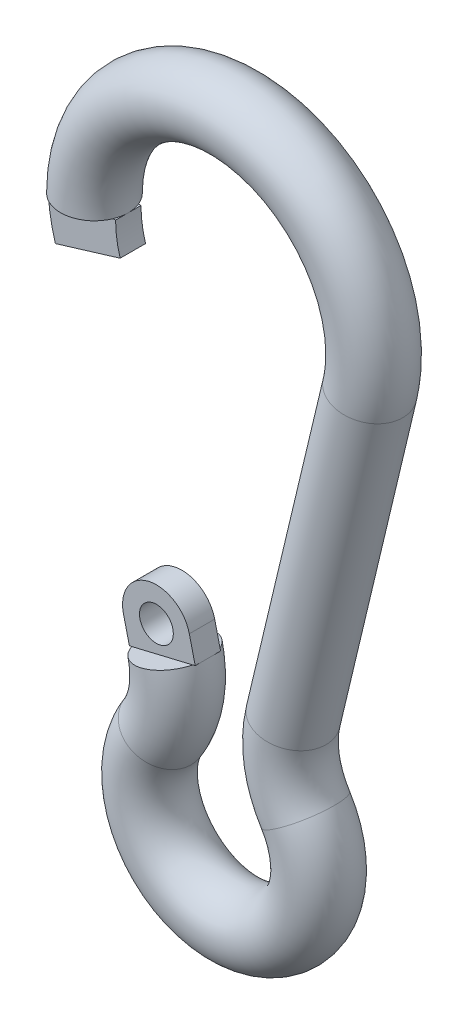
ISO-10303-21;
HEADER;
FILE_DESCRIPTION(('STEP AP214'),'2;1');
FILE_NAME('part.step','',(''),(''),'','','');
FILE_SCHEMA(('AUTOMOTIVE_DESIGN { 1 0 10303 214 1 1 1 1 }'));
ENDSEC;
DATA;
#1=APPLICATION_CONTEXT('core data for automotive mechanical design processes');
#2=APPLICATION_PROTOCOL_DEFINITION('international standard','automotive_design',2000,#1);
#3=PRODUCT_CONTEXT('',#1,'mechanical');
#4=PRODUCT('Part','Part','',(#3));
#5=PRODUCT_RELATED_PRODUCT_CATEGORY('part','',(#4));
#6=PRODUCT_DEFINITION_FORMATION('','',#4);
#7=PRODUCT_DEFINITION_CONTEXT('part definition',#1,'design');
#8=PRODUCT_DEFINITION('design','',#6,#7);
#9=PRODUCT_DEFINITION_SHAPE('','',#8);
#10=(LENGTH_UNIT() NAMED_UNIT(*) SI_UNIT(.MILLI.,.METRE.));
#11=(NAMED_UNIT(*) PLANE_ANGLE_UNIT() SI_UNIT($,.RADIAN.));
#12=(NAMED_UNIT(*) SI_UNIT($,.STERADIAN.) SOLID_ANGLE_UNIT());
#13=UNCERTAINTY_MEASURE_WITH_UNIT(LENGTH_MEASURE(1.E-05),#10,'distance_accuracy_value','');
#14=(GEOMETRIC_REPRESENTATION_CONTEXT(3) GLOBAL_UNCERTAINTY_ASSIGNED_CONTEXT((#13)) GLOBAL_UNIT_ASSIGNED_CONTEXT((#10,
#11,#12)) REPRESENTATION_CONTEXT('',''));
#15=CARTESIAN_POINT('',(0.,0.,0.));
#16=DIRECTION('',(0.,0.,1.));
#17=DIRECTION('',(1.,0.,0.));
#18=AXIS2_PLACEMENT_3D('',#15,#16,#17);
#19=CARTESIAN_POINT('',(-6.9800627029462,-41.8303564969621,0.));
#20=DIRECTION('',(0.232142913307645,-0.972681688838152,0.));
#21=DIRECTION('',(0.972681688838152,0.232142913307645,0.));
#22=AXIS2_PLACEMENT_3D('',#19,#20,#21);
#23=PLANE('',#22);
#24=DIRECTION('',(0.972681688838152,0.232142913307646,0.));
#25=VECTOR('',#24,1.);
#26=CARTESIAN_POINT('',(-3.08933594759359,-40.9017848437315,1.5));
#27=LINE('',#26,#25);
#28=CARTESIAN_POINT('',(-10.5868629375398,-42.6911654581932,1.5));
#29=VERTEX_POINT('',#28);
#30=CARTESIAN_POINT('',(-3.37326246835262,-40.969547535731,1.5));
#31=VERTEX_POINT('',#30);
#32=EDGE_CURVE('E64',#29,#31,#27,.T.);
#33=ORIENTED_EDGE('',*,*,#32,.F.);
#34=CARTESIAN_POINT('',(-6.9800627029462,-41.8303564969621,0.));
#35=DIRECTION('',(0.232142913307645,-0.972681688838152,0.));
#36=DIRECTION('',(0.972681688838152,0.232142913307645,0.));
#37=AXIS2_PLACEMENT_3D('',#34,#35,#36);
#38=CIRCLE('',#37,4.);
#39=EDGE_CURVE('E260',#31,#29,#38,.T.);
#40=ORIENTED_EDGE('',*,*,#39,.F.);
#41=EDGE_LOOP('',(#33,#40));
#42=FACE_BOUND('',#41,.T.);
#43=ADVANCED_FACE('F55',(#42),#23,.F.);
#44=CARTESIAN_POINT('',(-16.5,0.,0.));
#45=DIRECTION('',(0.,-1.,0.));
#46=DIRECTION('',(1.,0.,0.));
#47=AXIS2_PLACEMENT_3D('',#44,#45,#46);
#48=PLANE('',#47);
#49=CARTESIAN_POINT('',(-16.5,0.,0.));
#50=DIRECTION('',(0.,-1.,0.));
#51=DIRECTION('',(1.,0.,0.));
#52=AXIS2_PLACEMENT_3D('',#49,#50,#51);
#53=CIRCLE('',#52,4.);
#54=CARTESIAN_POINT('',(-20.2080992435478,0.,-1.5));
#55=VERTEX_POINT('',#54);
#56=CARTESIAN_POINT('',(-12.7919007564522,0.,-1.5));
#57=VERTEX_POINT('',#56);
#58=EDGE_CURVE('E374',#55,#57,#53,.T.);
#59=ORIENTED_EDGE('',*,*,#58,.T.);
#60=DIRECTION('',(-1.,0.,0.));
#61=VECTOR('',#60,1.);
#62=CARTESIAN_POINT('',(-20.5,-1.43150734892568E-13,-1.5));
#63=LINE('',#62,#61);
#64=EDGE_CURVE('E226',#57,#55,#63,.T.);
#65=ORIENTED_EDGE('',*,*,#64,.T.);
#66=EDGE_LOOP('',(#59,#65));
#67=FACE_BOUND('',#66,.T.);
#68=ADVANCED_FACE('F306',(#67),#48,.T.);
#69=DIRECTION('',(-1.,0.,0.));
#70=VECTOR('',#69,1.);
#71=CARTESIAN_POINT('',(-20.5,-1.43150734892568E-13,1.5));
#72=LINE('',#71,#70);
#73=CARTESIAN_POINT('',(-12.7919007564522,0.,1.5));
#74=VERTEX_POINT('',#73);
#75=CARTESIAN_POINT('',(-20.2080992435478,0.,1.5));
#76=VERTEX_POINT('',#75);
#77=EDGE_CURVE('E215',#74,#76,#72,.T.);
#78=ORIENTED_EDGE('',*,*,#77,.F.);
#79=EDGE_CURVE('E245',#74,#76,#53,.T.);
#80=ORIENTED_EDGE('',*,*,#79,.T.);
#81=EDGE_LOOP('',(#78,#80));
#82=FACE_BOUND('',#81,.T.);
#83=ADVANCED_FACE('F57',(#82),#48,.T.);
#84=CARTESIAN_POINT('',(-10.5868629375398,-42.6911654581932,-1.5));
#85=VERTEX_POINT('',#84);
#86=CARTESIAN_POINT('',(-3.37326246835262,-40.969547535731,-1.5));
#87=VERTEX_POINT('',#86);
#88=EDGE_CURVE('E74',#85,#87,#38,.T.);
#89=ORIENTED_EDGE('',*,*,#88,.F.);
#90=DIRECTION('',(0.972681688838152,0.232142913307646,0.));
#91=VECTOR('',#90,1.);
#92=CARTESIAN_POINT('',(-3.08933594759359,-40.9017848437315,-1.5));
#93=LINE('',#92,#91);
#94=EDGE_CURVE('E12',#85,#87,#93,.T.);
#95=ORIENTED_EDGE('',*,*,#94,.T.);
#96=EDGE_LOOP('',(#89,#95));
#97=FACE_BOUND('',#96,.T.);
#98=ADVANCED_FACE('F308',(#97),#23,.F.);
#99=CARTESIAN_POINT('',(0.,0.,0.));
#100=DIRECTION('',(0.,0.,-1.));
#101=DIRECTION('',(-1.,0.,0.));
#102=AXIS2_PLACEMENT_3D('',#99,#100,#101);
#103=TOROIDAL_SURFACE('',#102,16.5,4.);
#104=CARTESIAN_POINT('',(16.0492478658295,-3.83035806957611,0.));
#105=DIRECTION('',(0.232142913307642,0.972681688838152,0.));
#106=DIRECTION('',(-0.972681688838153,0.232142913307642,0.));
#107=AXIS2_PLACEMENT_3D('',#104,#105,#106);
#108=CIRCLE('',#107,4.);
#109=CARTESIAN_POINT('',(12.1585211104769,-2.90178641634554,0.));
#110=VERTEX_POINT('',#109);
#111=EDGE_CURVE('E244',#110,#110,#108,.T.);
#112=ORIENTED_EDGE('',*,*,#111,.T.);
#113=EDGE_LOOP('',(#112));
#114=FACE_BOUND('',#113,.T.);
#115=CARTESIAN_POINT('',(-12.5,0.,0.));
#116=VERTEX_POINT('',#115);
#117=EDGE_CURVE('E241',#116,#74,#53,.T.);
#118=ORIENTED_EDGE('',*,*,#117,.F.);
#119=EDGE_CURVE('E240',#57,#116,#53,.T.);
#120=ORIENTED_EDGE('',*,*,#119,.F.);
#121=ORIENTED_EDGE('',*,*,#58,.F.);
#122=CARTESIAN_POINT('',(-20.5,0.,0.));
#123=VERTEX_POINT('',#122);
#124=EDGE_CURVE('E375',#123,#55,#53,.T.);
#125=ORIENTED_EDGE('',*,*,#124,.F.);
#126=EDGE_CURVE('E378',#76,#123,#53,.T.);
#127=ORIENTED_EDGE('',*,*,#126,.F.);
#128=ORIENTED_EDGE('',*,*,#79,.F.);
#129=EDGE_LOOP('',(#118,#120,#121,#125,#127,#128));
#130=FACE_BOUND('',#129,.T.);
#131=ADVANCED_FACE('F316',(#114,#130),#103,.T.);
#132=CARTESIAN_POINT('',(16.0492478658295,-3.83035806957611,0.));
#133=DIRECTION('',(-0.232142913307644,-0.972681688838152,0.));
#134=DIRECTION('',(0.972681688838152,-0.232142913307644,0.));
#135=AXIS2_PLACEMENT_3D('',#132,#133,#134);
#136=CYLINDRICAL_SURFACE('',#135,4.);
#137=CARTESIAN_POINT('',(6.9800627029462,-41.8303564969621,0.));
#138=DIRECTION('',(0.232142913307642,0.972681688838153,0.));
#139=DIRECTION('',(-0.972681688838153,0.232142913307642,0.));
#140=AXIS2_PLACEMENT_3D('',#137,#138,#139);
#141=CIRCLE('',#140,4.);
#142=CARTESIAN_POINT('',(3.0893359475936,-40.9017848437315,0.));
#143=VERTEX_POINT('',#142);
#144=EDGE_CURVE('E248',#143,#143,#141,.T.);
#145=ORIENTED_EDGE('',*,*,#144,.T.);
#146=EDGE_LOOP('',(#145));
#147=FACE_BOUND('',#146,.T.);
#148=ORIENTED_EDGE('',*,*,#111,.F.);
#149=EDGE_LOOP('',(#148));
#150=FACE_BOUND('',#149,.T.);
#151=ADVANCED_FACE('F321',(#147,#150),#136,.T.);
#152=CARTESIAN_POINT('',(18.1659021245849,-44.5,0.));
#153=DIRECTION('',(0.,0.,1.));
#154=DIRECTION('',(1.,0.,0.));
#155=AXIS2_PLACEMENT_3D('',#152,#153,#154);
#156=TOROIDAL_SURFACE('',#155,11.5,4.);
#157=CARTESIAN_POINT('',(8.44925680213253,-50.6511627906977,0.));
#158=DIRECTION('',(-0.534883720930233,0.844925680213253,0.));
#159=DIRECTION('',(-0.844925680213253,-0.534883720930233,0.));
#160=AXIS2_PLACEMENT_3D('',#157,#158,#159);
#161=CIRCLE('',#160,4.);
#162=CARTESIAN_POINT('',(5.06955408127952,-52.7906976744186,0.));
#163=VERTEX_POINT('',#162);
#164=EDGE_CURVE('E251',#163,#163,#161,.T.);
#165=CARTESIAN_POINT('',(18.1659021245849,-44.5,0.));
#166=DIRECTION('',(0.,0.,1.));
#167=DIRECTION('',(1.,0.,0.));
#168=AXIS2_PLACEMENT_3D('',#165,#166,#167);
#169=CIRCLE('',#168,15.5);
#170=EDGE_CURVE('',#143,#163,#169,.T.);
#171=ORIENTED_EDGE('',*,*,#144,.F.);
#172=ORIENTED_EDGE('',*,*,#164,.T.);
#173=ORIENTED_EDGE('',*,*,#170,.T.);
#174=ORIENTED_EDGE('',*,*,#170,.F.);
#175=EDGE_LOOP('',(#171,#173,#172,#174));
#176=FACE_BOUND('',#175,.T.);
#177=ADVANCED_FACE('F528',(#176),#156,.T.);
#178=CARTESIAN_POINT('',(0.,-56.,0.));
#179=DIRECTION('',(0.,0.,-1.));
#180=DIRECTION('',(-1.,0.,0.));
#181=AXIS2_PLACEMENT_3D('',#178,#179,#180);
#182=TOROIDAL_SURFACE('',#181,10.,4.);
#183=CARTESIAN_POINT('',(-8.44925680213253,-50.6511627906977,0.));
#184=DIRECTION('',(-0.534883720930231,-0.844925680213254,0.));
#185=DIRECTION('',(0.844925680213254,-0.534883720930232,0.));
#186=AXIS2_PLACEMENT_3D('',#183,#184,#185);
#187=CIRCLE('',#186,4.);
#188=CARTESIAN_POINT('',(-5.06955408127951,-52.7906976744186,0.));
#189=VERTEX_POINT('',#188);
#190=EDGE_CURVE('E253',#189,#189,#187,.T.);
#191=ORIENTED_EDGE('',*,*,#190,.T.);
#192=EDGE_LOOP('',(#191));
#193=FACE_BOUND('',#192,.T.);
#194=ORIENTED_EDGE('',*,*,#164,.F.);
#195=EDGE_LOOP('',(#194));
#196=FACE_BOUND('',#195,.T.);
#197=ADVANCED_FACE('F339',(#193,#196),#182,.T.);
#198=CARTESIAN_POINT('',(-18.1659021245849,-44.5,0.));
#199=DIRECTION('',(0.,0.,1.));
#200=DIRECTION('',(1.,0.,0.));
#201=AXIS2_PLACEMENT_3D('',#198,#199,#200);
#202=TOROIDAL_SURFACE('',#201,11.5,4.);
#203=CARTESIAN_POINT('',(-3.08933594759359,-40.9017848437315,0.));
#204=VERTEX_POINT('',#203);
#205=EDGE_CURVE('E59',#204,#31,#38,.T.);
#206=ORIENTED_EDGE('',*,*,#205,.T.);
#207=ORIENTED_EDGE('',*,*,#39,.T.);
#208=CARTESIAN_POINT('',(-10.8707894582988,-42.7589281501927,0.));
#209=VERTEX_POINT('',#208);
#210=EDGE_CURVE('E264',#29,#209,#38,.T.);
#211=ORIENTED_EDGE('',*,*,#210,.T.);
#212=EDGE_CURVE('E259',#209,#85,#38,.T.);
#213=ORIENTED_EDGE('',*,*,#212,.T.);
#214=ORIENTED_EDGE('',*,*,#88,.T.);
#215=EDGE_CURVE('E172',#87,#204,#38,.T.);
#216=ORIENTED_EDGE('',*,*,#215,.T.);
#217=EDGE_LOOP('',(#206,#207,#211,#213,#214,#216));
#218=FACE_BOUND('',#217,.T.);
#219=ORIENTED_EDGE('',*,*,#190,.F.);
#220=EDGE_LOOP('',(#219));
#221=FACE_BOUND('',#220,.T.);
#222=ADVANCED_FACE('F267',(#218,#221),#202,.T.);
#223=CARTESIAN_POINT('',(-20.5,-1.43150734892568E-13,1.5));
#224=DIRECTION('',(0.,-1.,0.));
#225=DIRECTION('',(1.,0.,0.));
#226=AXIS2_PLACEMENT_3D('',#223,#224,#225);
#227=PLANE('',#226);
#228=CARTESIAN_POINT('',(-20.5,-1.43150734892568E-13,1.5));
#229=VERTEX_POINT('',#228);
#230=EDGE_CURVE('E210',#76,#229,#72,.T.);
#231=ORIENTED_EDGE('',*,*,#230,.F.);
#232=ORIENTED_EDGE('',*,*,#126,.T.);
#233=DIRECTION('',(0.,0.,-1.));
#234=VECTOR('',#233,1.);
#235=CARTESIAN_POINT('',(-20.5,-1.43150734892568E-13,1.5));
#236=LINE('',#235,#234);
#237=EDGE_CURVE('E227',#229,#123,#236,.T.);
#238=ORIENTED_EDGE('',*,*,#237,.F.);
#239=EDGE_LOOP('',(#231,#232,#238));
#240=FACE_BOUND('',#239,.T.);
#241=ADVANCED_FACE('F325',(#240),#227,.F.);
#242=CARTESIAN_POINT('',(-20.5,-1.43150734892568E-13,-1.5));
#243=VERTEX_POINT('',#242);
#244=EDGE_CURVE('E214',#123,#243,#236,.T.);
#245=ORIENTED_EDGE('',*,*,#244,.F.);
#246=ORIENTED_EDGE('',*,*,#124,.T.);
#247=EDGE_CURVE('E223',#55,#243,#63,.T.);
#248=ORIENTED_EDGE('',*,*,#247,.T.);
#249=EDGE_LOOP('',(#245,#246,#248));
#250=FACE_BOUND('',#249,.T.);
#251=ADVANCED_FACE('F329',(#250),#227,.F.);
#252=DIRECTION('',(0.,0.,-1.));
#253=VECTOR('',#252,1.);
#254=CARTESIAN_POINT('',(-12.5,-1.43114686768087E-13,1.5));
#255=LINE('',#254,#253);
#256=CARTESIAN_POINT('',(-12.5,-1.43114686768087E-13,1.5));
#257=VERTEX_POINT('',#256);
#258=EDGE_CURVE('E231',#257,#116,#255,.T.);
#259=ORIENTED_EDGE('',*,*,#258,.T.);
#260=ORIENTED_EDGE('',*,*,#117,.T.);
#261=EDGE_CURVE('E211',#257,#74,#72,.T.);
#262=ORIENTED_EDGE('',*,*,#261,.F.);
#263=EDGE_LOOP('',(#259,#260,#262));
#264=FACE_BOUND('',#263,.T.);
#265=ADVANCED_FACE('F337',(#264),#227,.F.);
#266=CARTESIAN_POINT('',(0.,0.,1.5));
#267=DIRECTION('',(0.,0.,-1.));
#268=DIRECTION('',(-1.,0.,0.));
#269=AXIS2_PLACEMENT_3D('',#266,#267,#268);
#270=CYLINDRICAL_SURFACE('',#269,20.5);
#271=CARTESIAN_POINT('',(0.,0.,-1.5));
#272=DIRECTION('',(0.,0.,1.));
#273=DIRECTION('',(1.,0.,0.));
#274=AXIS2_PLACEMENT_3D('',#271,#272,#273);
#275=CIRCLE('',#274,20.5);
#276=CARTESIAN_POINT('',(-19.6145969362954,-5.95966333165492,-1.5));
#277=VERTEX_POINT('',#276);
#278=EDGE_CURVE('E200',#243,#277,#275,.T.);
#279=ORIENTED_EDGE('',*,*,#278,.T.);
#280=DIRECTION('',(0.,0.,-1.));
#281=VECTOR('',#280,1.);
#282=CARTESIAN_POINT('',(-19.6145969362954,-5.95966333165492,1.5));
#283=LINE('',#282,#281);
#284=CARTESIAN_POINT('',(-19.6145969362954,-5.95966333165492,1.5));
#285=VERTEX_POINT('',#284);
#286=EDGE_CURVE('E237',#285,#277,#283,.T.);
#287=ORIENTED_EDGE('',*,*,#286,.F.);
#288=CARTESIAN_POINT('',(0.,0.,1.5));
#289=DIRECTION('',(0.,0.,1.));
#290=DIRECTION('',(1.,0.,0.));
#291=AXIS2_PLACEMENT_3D('',#288,#289,#290);
#292=CIRCLE('',#291,20.5);
#293=EDGE_CURVE('E202',#229,#285,#292,.T.);
#294=ORIENTED_EDGE('',*,*,#293,.F.);
#295=ORIENTED_EDGE('',*,*,#237,.T.);
#296=ORIENTED_EDGE('',*,*,#244,.T.);
#297=EDGE_LOOP('',(#279,#287,#294,#295,#296));
#298=FACE_BOUND('',#297,.T.);
#299=ADVANCED_FACE('F357',(#298),#270,.T.);
#300=CARTESIAN_POINT('',(-19.6145969362954,-5.95966333165492,1.5));
#301=DIRECTION('',(-0.290715284470972,0.956809606648555,0.));
#302=DIRECTION('',(-0.956809606648555,-0.290715284470972,0.));
#303=AXIS2_PLACEMENT_3D('',#300,#301,#302);
#304=PLANE('',#303);
#305=DIRECTION('',(0.956809606648555,0.290715284470972,0.));
#306=VECTOR('',#305,1.);
#307=CARTESIAN_POINT('',(-19.6145969362954,-5.95966333165492,-1.5));
#308=LINE('',#307,#306);
#309=CARTESIAN_POINT('',(-11.9601200831069,-3.63394105588715,-1.5));
#310=VERTEX_POINT('',#309);
#311=EDGE_CURVE('E218',#277,#310,#308,.T.);
#312=ORIENTED_EDGE('',*,*,#311,.T.);
#313=DIRECTION('',(0.,0.,-1.));
#314=VECTOR('',#313,1.);
#315=CARTESIAN_POINT('',(-11.9601200831069,-3.63394105588715,1.5));
#316=LINE('',#315,#314);
#317=CARTESIAN_POINT('',(-11.9601200831069,-3.63394105588715,1.5));
#318=VERTEX_POINT('',#317);
#319=EDGE_CURVE('E234',#318,#310,#316,.T.);
#320=ORIENTED_EDGE('',*,*,#319,.F.);
#321=DIRECTION('',(0.956809606648555,0.290715284470972,0.));
#322=VECTOR('',#321,1.);
#323=CARTESIAN_POINT('',(-19.6145969362954,-5.95966333165492,1.5));
#324=LINE('',#323,#322);
#325=EDGE_CURVE('E205',#285,#318,#324,.T.);
#326=ORIENTED_EDGE('',*,*,#325,.F.);
#327=ORIENTED_EDGE('',*,*,#286,.T.);
#328=EDGE_LOOP('',(#312,#320,#326,#327));
#329=FACE_BOUND('',#328,.T.);
#330=ADVANCED_FACE('F354',(#329),#304,.F.);
#331=CARTESIAN_POINT('',(0.,0.,1.5));
#332=DIRECTION('',(0.,0.,-1.));
#333=DIRECTION('',(-1.,0.,0.));
#334=AXIS2_PLACEMENT_3D('',#331,#332,#333);
#335=CYLINDRICAL_SURFACE('',#334,12.5);
#336=CARTESIAN_POINT('',(0.,0.,-1.5));
#337=DIRECTION('',(0.,0.,-1.));
#338=DIRECTION('',(1.,0.,0.));
#339=AXIS2_PLACEMENT_3D('',#336,#337,#338);
#340=CIRCLE('',#339,12.5);
#341=CARTESIAN_POINT('',(-12.5,-1.43114686768087E-13,-1.5));
#342=VERTEX_POINT('',#341);
#343=EDGE_CURVE('E220',#310,#342,#340,.T.);
#344=ORIENTED_EDGE('',*,*,#343,.T.);
#345=EDGE_CURVE('E230',#116,#342,#255,.T.);
#346=ORIENTED_EDGE('',*,*,#345,.F.);
#347=ORIENTED_EDGE('',*,*,#258,.F.);
#348=CARTESIAN_POINT('',(0.,0.,1.5));
#349=DIRECTION('',(0.,0.,-1.));
#350=DIRECTION('',(1.,0.,0.));
#351=AXIS2_PLACEMENT_3D('',#348,#349,#350);
#352=CIRCLE('',#351,12.5);
#353=EDGE_CURVE('E208',#318,#257,#352,.T.);
#354=ORIENTED_EDGE('',*,*,#353,.F.);
#355=ORIENTED_EDGE('',*,*,#319,.T.);
#356=EDGE_LOOP('',(#344,#346,#347,#354,#355));
#357=FACE_BOUND('',#356,.T.);
#358=ADVANCED_FACE('F345',(#357),#335,.F.);
#359=EDGE_CURVE('E206',#342,#57,#63,.T.);
#360=ORIENTED_EDGE('',*,*,#359,.T.);
#361=ORIENTED_EDGE('',*,*,#119,.T.);
#362=ORIENTED_EDGE('',*,*,#345,.T.);
#363=EDGE_LOOP('',(#360,#361,#362));
#364=FACE_BOUND('',#363,.T.);
#365=ADVANCED_FACE('F332',(#364),#227,.F.);
#366=CARTESIAN_POINT('',(0.,0.,1.5));
#367=DIRECTION('',(0.,0.,1.));
#368=DIRECTION('',(1.,0.,0.));
#369=AXIS2_PLACEMENT_3D('',#366,#367,#368);
#370=PLANE('',#369);
#371=ORIENTED_EDGE('',*,*,#293,.T.);
#372=ORIENTED_EDGE('',*,*,#325,.T.);
#373=ORIENTED_EDGE('',*,*,#353,.T.);
#374=ORIENTED_EDGE('',*,*,#261,.T.);
#375=ORIENTED_EDGE('',*,*,#77,.T.);
#376=ORIENTED_EDGE('',*,*,#230,.T.);
#377=EDGE_LOOP('',(#371,#372,#373,#374,#375,#376));
#378=FACE_BOUND('',#377,.T.);
#379=ADVANCED_FACE('F344',(#378),#370,.T.);
#380=CARTESIAN_POINT('',(0.,0.,-1.5));
#381=DIRECTION('',(0.,0.,1.));
#382=DIRECTION('',(1.,0.,0.));
#383=AXIS2_PLACEMENT_3D('',#380,#381,#382);
#384=PLANE('',#383);
#385=ORIENTED_EDGE('',*,*,#278,.F.);
#386=ORIENTED_EDGE('',*,*,#247,.F.);
#387=ORIENTED_EDGE('',*,*,#64,.F.);
#388=ORIENTED_EDGE('',*,*,#359,.F.);
#389=ORIENTED_EDGE('',*,*,#343,.F.);
#390=ORIENTED_EDGE('',*,*,#311,.F.);
#391=EDGE_LOOP('',(#385,#386,#387,#388,#389,#390));
#392=FACE_BOUND('',#391,.T.);
#393=ADVANCED_FACE('F351',(#392),#384,.F.);
#394=CARTESIAN_POINT('',(-3.08933594759359,-40.9017848437315,1.5));
#395=DIRECTION('',(-0.232142913307646,0.972681688838152,0.));
#396=DIRECTION('',(-0.972681688838152,-0.232142913307646,0.));
#397=AXIS2_PLACEMENT_3D('',#394,#395,#396);
#398=PLANE('',#397);
#399=ORIENTED_EDGE('',*,*,#210,.F.);
#400=CARTESIAN_POINT('',(-10.8707894582988,-42.7589281501927,1.5));
#401=VERTEX_POINT('',#400);
#402=EDGE_CURVE('E189',#401,#29,#27,.T.);
#403=ORIENTED_EDGE('',*,*,#402,.F.);
#404=DIRECTION('',(0.,0.,-1.));
#405=VECTOR('',#404,1.);
#406=CARTESIAN_POINT('',(-10.8707894582988,-42.7589281501927,1.5));
#407=LINE('',#406,#405);
#408=EDGE_CURVE('E168',#401,#209,#407,.T.);
#409=ORIENTED_EDGE('',*,*,#408,.T.);
#410=EDGE_LOOP('',(#399,#403,#409));
#411=FACE_BOUND('',#410,.T.);
#412=ADVANCED_FACE('F299',(#411),#398,.F.);
#413=ORIENTED_EDGE('',*,*,#212,.F.);
#414=CARTESIAN_POINT('',(-10.8707894582988,-42.7589281501927,-1.5));
#415=VERTEX_POINT('',#414);
#416=EDGE_CURVE('E274',#209,#415,#407,.T.);
#417=ORIENTED_EDGE('',*,*,#416,.T.);
#418=EDGE_CURVE('E66',#415,#85,#93,.T.);
#419=ORIENTED_EDGE('',*,*,#418,.T.);
#420=EDGE_LOOP('',(#413,#417,#419));
#421=FACE_BOUND('',#420,.T.);
#422=ADVANCED_FACE('F273',(#421),#398,.F.);
#423=ORIENTED_EDGE('',*,*,#205,.F.);
#424=DIRECTION('',(0.,0.,-1.));
#425=VECTOR('',#424,1.);
#426=CARTESIAN_POINT('',(-3.08933594759359,-40.9017848437315,1.5));
#427=LINE('',#426,#425);
#428=CARTESIAN_POINT('',(-3.08933594759359,-40.9017848437315,1.5));
#429=VERTEX_POINT('',#428);
#430=EDGE_CURVE('E165',#429,#204,#427,.T.);
#431=ORIENTED_EDGE('',*,*,#430,.F.);
#432=EDGE_CURVE('E193',#31,#429,#27,.T.);
#433=ORIENTED_EDGE('',*,*,#432,.F.);
#434=EDGE_LOOP('',(#423,#431,#433));
#435=FACE_BOUND('',#434,.T.);
#436=ADVANCED_FACE('F291',(#435),#398,.F.);
#437=CARTESIAN_POINT('',(-7.67649144286914,-38.9123114304476,1.5));
#438=DIRECTION('',(0.,0.,-1.));
#439=DIRECTION('',(-1.,0.,0.));
#440=AXIS2_PLACEMENT_3D('',#437,#438,#439);
#441=PLANE('',#440);
#442=DIRECTION('',(-0.232142913307646,0.972681688838152,0.));
#443=VECTOR('',#442,1.);
#444=CARTESIAN_POINT('',(-3.78576468751653,-37.9837397772171,1.5));
#445=LINE('',#444,#443);
#446=CARTESIAN_POINT('',(-3.78576468751653,-37.9837397772171,1.5));
#447=VERTEX_POINT('',#446);
#448=EDGE_CURVE('E174',#429,#447,#445,.T.);
#449=ORIENTED_EDGE('',*,*,#448,.T.);
#450=CARTESIAN_POINT('',(-7.67649144286914,-38.9123114304476,1.5));
#451=DIRECTION('',(0.,0.,1.));
#452=DIRECTION('',(-1.,0.,0.));
#453=AXIS2_PLACEMENT_3D('',#450,#451,#452);
#454=CIRCLE('',#453,4.);
#455=CARTESIAN_POINT('',(-11.5672181982218,-39.8408830836782,1.5));
#456=VERTEX_POINT('',#455);
#457=EDGE_CURVE('E195',#447,#456,#454,.T.);
#458=ORIENTED_EDGE('',*,*,#457,.T.);
#459=DIRECTION('',(0.232142913307647,-0.972681688838151,0.));
#460=VECTOR('',#459,1.);
#461=CARTESIAN_POINT('',(-10.8707894582988,-42.7589281501927,1.5));
#462=LINE('',#461,#460);
#463=EDGE_CURVE('E192',#456,#401,#462,.T.);
#464=ORIENTED_EDGE('',*,*,#463,.T.);
#465=ORIENTED_EDGE('',*,*,#402,.T.);
#466=ORIENTED_EDGE('',*,*,#32,.T.);
#467=ORIENTED_EDGE('',*,*,#432,.T.);
#468=EDGE_LOOP('',(#449,#458,#464,#465,#466,#467));
#469=FACE_BOUND('',#468,.T.);
#470=CARTESIAN_POINT('',(-7.67649144286914,-38.9123114304476,1.5));
#471=DIRECTION('',(0.,0.,1.));
#472=DIRECTION('',(1.,0.,0.));
#473=AXIS2_PLACEMENT_3D('',#470,#471,#472);
#474=CIRCLE('',#473,2.);
#475=CARTESIAN_POINT('',(-5.67649144286914,-38.9123114304476,1.5));
#476=VERTEX_POINT('',#475);
#477=EDGE_CURVE('E180',#476,#476,#474,.T.);
#478=ORIENTED_EDGE('',*,*,#477,.F.);
#479=EDGE_LOOP('',(#478));
#480=FACE_BOUND('',#479,.T.);
#481=ADVANCED_FACE('F287',(#469,#480),#441,.F.);
#482=CARTESIAN_POINT('',(-7.67649144286914,-38.9123114304476,-1.5));
#483=DIRECTION('',(0.,0.,-1.));
#484=DIRECTION('',(-1.,0.,0.));
#485=AXIS2_PLACEMENT_3D('',#482,#483,#484);
#486=PLANE('',#485);
#487=DIRECTION('',(-0.232142913307646,0.972681688838152,0.));
#488=VECTOR('',#487,1.);
#489=CARTESIAN_POINT('',(-3.78576468751653,-37.9837397772171,-1.5));
#490=LINE('',#489,#488);
#491=CARTESIAN_POINT('',(-3.08933594759359,-40.9017848437315,-1.5));
#492=VERTEX_POINT('',#491);
#493=CARTESIAN_POINT('',(-3.78576468751653,-37.9837397772171,-1.5));
#494=VERTEX_POINT('',#493);
#495=EDGE_CURVE('E162',#492,#494,#490,.T.);
#496=ORIENTED_EDGE('',*,*,#495,.F.);
#497=EDGE_CURVE('E67',#87,#492,#93,.T.);
#498=ORIENTED_EDGE('',*,*,#497,.F.);
#499=ORIENTED_EDGE('',*,*,#94,.F.);
#500=ORIENTED_EDGE('',*,*,#418,.F.);
#501=DIRECTION('',(0.232142913307647,-0.972681688838151,0.));
#502=VECTOR('',#501,1.);
#503=CARTESIAN_POINT('',(-10.8707894582988,-42.7589281501927,-1.5));
#504=LINE('',#503,#502);
#505=CARTESIAN_POINT('',(-11.5672181982218,-39.8408830836782,-1.5));
#506=VERTEX_POINT('',#505);
#507=EDGE_CURVE('E185',#506,#415,#504,.T.);
#508=ORIENTED_EDGE('',*,*,#507,.F.);
#509=CARTESIAN_POINT('',(-7.67649144286914,-38.9123114304476,-1.5));
#510=DIRECTION('',(0.,0.,1.));
#511=DIRECTION('',(-1.,0.,0.));
#512=AXIS2_PLACEMENT_3D('',#509,#510,#511);
#513=CIRCLE('',#512,4.);
#514=EDGE_CURVE('E178',#494,#506,#513,.T.);
#515=ORIENTED_EDGE('',*,*,#514,.F.);
#516=EDGE_LOOP('',(#496,#498,#499,#500,#508,#515));
#517=FACE_BOUND('',#516,.T.);
#518=CARTESIAN_POINT('',(-7.67649144286914,-38.9123114304476,-1.5));
#519=DIRECTION('',(0.,0.,1.));
#520=DIRECTION('',(1.,0.,0.));
#521=AXIS2_PLACEMENT_3D('',#518,#519,#520);
#522=CIRCLE('',#521,2.);
#523=CARTESIAN_POINT('',(-5.67649144286914,-38.9123114304476,-1.5));
#524=VERTEX_POINT('',#523);
#525=EDGE_CURVE('E183',#524,#524,#522,.T.);
#526=ORIENTED_EDGE('',*,*,#525,.T.);
#527=EDGE_LOOP('',(#526));
#528=FACE_BOUND('',#527,.T.);
#529=ADVANCED_FACE('F175',(#517,#528),#486,.T.);
#530=CARTESIAN_POINT('',(-3.78576468751653,-37.9837397772171,1.5));
#531=DIRECTION('',(-0.972681688838152,-0.232142913307646,0.));
#532=DIRECTION('',(0.232142913307646,-0.972681688838152,0.));
#533=AXIS2_PLACEMENT_3D('',#530,#531,#532);
#534=PLANE('',#533);
#535=ORIENTED_EDGE('',*,*,#495,.T.);
#536=DIRECTION('',(0.,0.,-1.));
#537=VECTOR('',#536,1.);
#538=CARTESIAN_POINT('',(-3.78576468751653,-37.9837397772171,1.5));
#539=LINE('',#538,#537);
#540=EDGE_CURVE('E282',#447,#494,#539,.T.);
#541=ORIENTED_EDGE('',*,*,#540,.F.);
#542=ORIENTED_EDGE('',*,*,#448,.F.);
#543=ORIENTED_EDGE('',*,*,#430,.T.);
#544=EDGE_CURVE('E157',#204,#492,#427,.T.);
#545=ORIENTED_EDGE('',*,*,#544,.T.);
#546=EDGE_LOOP('',(#535,#541,#542,#543,#545));
#547=FACE_BOUND('',#546,.T.);
#548=ADVANCED_FACE('F159',(#547),#534,.F.);
#549=CARTESIAN_POINT('',(-7.67649144286914,-38.9123114304476,1.5));
#550=DIRECTION('',(0.,0.,-1.));
#551=DIRECTION('',(-1.,0.,0.));
#552=AXIS2_PLACEMENT_3D('',#549,#550,#551);
#553=CYLINDRICAL_SURFACE('',#552,4.);
#554=ORIENTED_EDGE('',*,*,#514,.T.);
#555=DIRECTION('',(0.,0.,-1.));
#556=VECTOR('',#555,1.);
#557=CARTESIAN_POINT('',(-11.5672181982218,-39.8408830836782,1.5));
#558=LINE('',#557,#556);
#559=EDGE_CURVE('E279',#456,#506,#558,.T.);
#560=ORIENTED_EDGE('',*,*,#559,.F.);
#561=ORIENTED_EDGE('',*,*,#457,.F.);
#562=ORIENTED_EDGE('',*,*,#540,.T.);
#563=EDGE_LOOP('',(#554,#560,#561,#562));
#564=FACE_BOUND('',#563,.T.);
#565=ADVANCED_FACE('F284',(#564),#553,.T.);
#566=CARTESIAN_POINT('',(-10.8707894582988,-42.7589281501927,1.5));
#567=DIRECTION('',(0.972681688838151,0.232142913307647,0.));
#568=DIRECTION('',(-0.232142913307647,0.972681688838151,0.));
#569=AXIS2_PLACEMENT_3D('',#566,#567,#568);
#570=PLANE('',#569);
#571=ORIENTED_EDGE('',*,*,#507,.T.);
#572=ORIENTED_EDGE('',*,*,#416,.F.);
#573=ORIENTED_EDGE('',*,*,#408,.F.);
#574=ORIENTED_EDGE('',*,*,#463,.F.);
#575=ORIENTED_EDGE('',*,*,#559,.T.);
#576=EDGE_LOOP('',(#571,#572,#573,#574,#575));
#577=FACE_BOUND('',#576,.T.);
#578=ADVANCED_FACE('F304',(#577),#570,.F.);
#579=ORIENTED_EDGE('',*,*,#215,.F.);
#580=ORIENTED_EDGE('',*,*,#497,.T.);
#581=ORIENTED_EDGE('',*,*,#544,.F.);
#582=EDGE_LOOP('',(#579,#580,#581));
#583=FACE_BOUND('',#582,.T.);
#584=ADVANCED_FACE('F171',(#583),#398,.F.);
#585=CARTESIAN_POINT('',(-7.67649144286914,-38.9123114304476,1.5));
#586=DIRECTION('',(0.,0.,-1.));
#587=DIRECTION('',(-1.,0.,0.));
#588=AXIS2_PLACEMENT_3D('',#585,#586,#587);
#589=CYLINDRICAL_SURFACE('',#588,2.);
#590=ORIENTED_EDGE('',*,*,#477,.T.);
#591=EDGE_LOOP('',(#590));
#592=FACE_BOUND('',#591,.T.);
#593=ORIENTED_EDGE('',*,*,#525,.F.);
#594=EDGE_LOOP('',(#593));
#595=FACE_BOUND('',#594,.T.);
#596=ADVANCED_FACE('F303',(#592,#595),#589,.F.);
#597=CLOSED_SHELL('',(#43,#68,#83,#98,#131,#151,#177,#197,#222,#241,#251,#265,#299,#330,#358,
#365,#379,#393,#412,#422,#436,#481,#529,#548,#565,#578,#584,#596));
#598=MANIFOLD_SOLID_BREP('B2',#597);
#599=ADVANCED_BREP_SHAPE_REPRESENTATION('',(#18,#598),#14);
#600=SHAPE_DEFINITION_REPRESENTATION(#9,#599);
ENDSEC;
END-ISO-10303-21;
